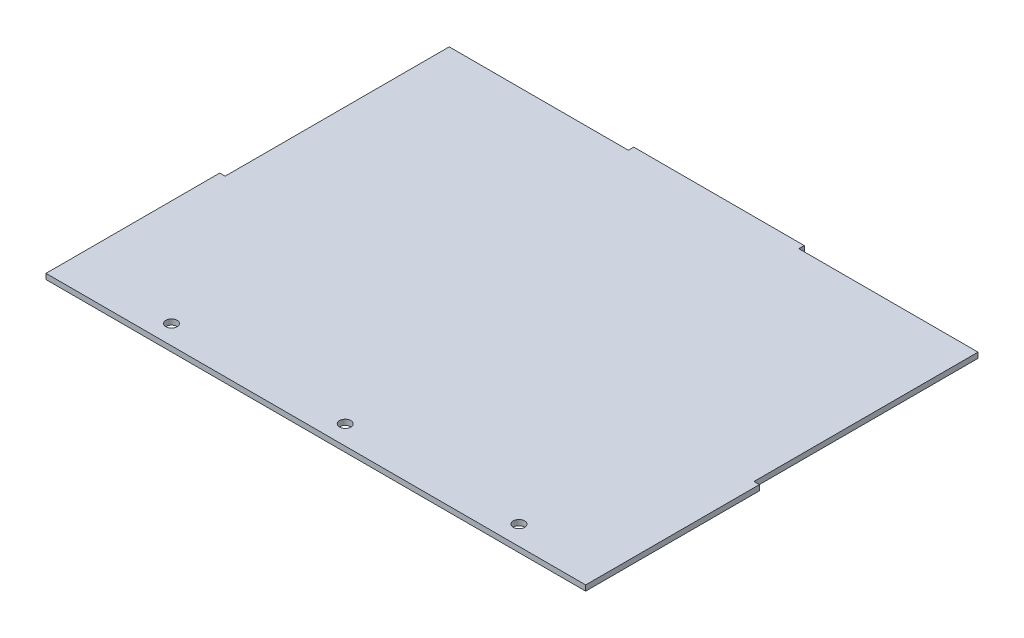
ISO-10303-21;
HEADER;
FILE_DESCRIPTION(('STEP AP214'),'2;1');
FILE_NAME('part.step','',(''),(''),'','','');
FILE_SCHEMA(('AUTOMOTIVE_DESIGN { 1 0 10303 214 1 1 1 1 }'));
ENDSEC;
DATA;
#1=APPLICATION_CONTEXT('core data for automotive mechanical design processes');
#2=APPLICATION_PROTOCOL_DEFINITION('international standard','automotive_design',2000,#1);
#3=PRODUCT_CONTEXT('',#1,'mechanical');
#4=PRODUCT('Part','Part','',(#3));
#5=PRODUCT_RELATED_PRODUCT_CATEGORY('part','',(#4));
#6=PRODUCT_DEFINITION_FORMATION('','',#4);
#7=PRODUCT_DEFINITION_CONTEXT('part definition',#1,'design');
#8=PRODUCT_DEFINITION('design','',#6,#7);
#9=PRODUCT_DEFINITION_SHAPE('','',#8);
#10=(LENGTH_UNIT() NAMED_UNIT(*) SI_UNIT(.MILLI.,.METRE.));
#11=(NAMED_UNIT(*) PLANE_ANGLE_UNIT() SI_UNIT($,.RADIAN.));
#12=(NAMED_UNIT(*) SI_UNIT($,.STERADIAN.) SOLID_ANGLE_UNIT());
#13=UNCERTAINTY_MEASURE_WITH_UNIT(LENGTH_MEASURE(1.E-05),#10,'distance_accuracy_value','');
#14=(GEOMETRIC_REPRESENTATION_CONTEXT(3) GLOBAL_UNCERTAINTY_ASSIGNED_CONTEXT((#13)) GLOBAL_UNIT_ASSIGNED_CONTEXT((#10,
#11,#12)) REPRESENTATION_CONTEXT('',''));
#15=CARTESIAN_POINT('',(0.,0.,0.));
#16=DIRECTION('',(0.,0.,1.));
#17=DIRECTION('',(1.,0.,0.));
#18=AXIS2_PLACEMENT_3D('',#15,#16,#17);
#19=CARTESIAN_POINT('',(0.,0.,0.));
#20=DIRECTION('',(0.,0.,-1.));
#21=DIRECTION('',(-1.,0.,0.));
#22=AXIS2_PLACEMENT_3D('',#19,#20,#21);
#23=PLANE('',#22);
#24=DIRECTION('',(0.,-1.,0.));
#25=VECTOR('',#24,1.);
#26=CARTESIAN_POINT('',(49.84,1.5875,0.));
#27=LINE('',#26,#25);
#28=CARTESIAN_POINT('',(49.84,1.5875,0.));
#29=VERTEX_POINT('',#28);
#30=CARTESIAN_POINT('',(49.84,-1.5875,0.));
#31=VERTEX_POINT('',#30);
#32=EDGE_CURVE('E152',#29,#31,#27,.T.);
#33=ORIENTED_EDGE('',*,*,#32,.F.);
#34=DIRECTION('',(-1.,0.,0.));
#35=VECTOR('',#34,1.);
#36=CARTESIAN_POINT('',(-157.79,1.5875,0.));
#37=LINE('',#36,#35);
#38=CARTESIAN_POINT('',(154.615,1.5875,0.));
#39=VERTEX_POINT('',#38);
#40=EDGE_CURVE('E219',#39,#29,#37,.T.);
#41=ORIENTED_EDGE('',*,*,#40,.F.);
#42=DIRECTION('',(0.,1.,0.));
#43=VECTOR('',#42,1.);
#44=CARTESIAN_POINT('',(154.615,-1.5875,0.));
#45=LINE('',#44,#43);
#46=CARTESIAN_POINT('',(154.615,-1.5875,0.));
#47=VERTEX_POINT('',#46);
#48=EDGE_CURVE('E175',#47,#39,#45,.T.);
#49=ORIENTED_EDGE('',*,*,#48,.F.);
#50=DIRECTION('',(1.,0.,0.));
#51=VECTOR('',#50,1.);
#52=CARTESIAN_POINT('',(-157.79,-1.5875,0.));
#53=LINE('',#52,#51);
#54=EDGE_CURVE('E54',#31,#47,#53,.T.);
#55=ORIENTED_EDGE('',*,*,#54,.F.);
#56=EDGE_LOOP('',(#33,#41,#49,#55));
#57=FACE_BOUND('',#56,.T.);
#58=ADVANCED_FACE('F39',(#57),#23,.T.);
#59=CARTESIAN_POINT('',(-95.7046067812089,1.5875,221.308349999902));
#60=DIRECTION('',(0.,-1.,0.));
#61=DIRECTION('',(0.,0.,-1.));
#62=AXIS2_PLACEMENT_3D('',#59,#60,#61);
#63=CYLINDRICAL_SURFACE('',#62,3.302);
#64=CARTESIAN_POINT('',(-95.7046067812089,1.5875,221.308349999902));
#65=DIRECTION('',(0.,-1.,0.));
#66=DIRECTION('',(0.,0.,-1.));
#67=AXIS2_PLACEMENT_3D('',#64,#65,#66);
#68=CIRCLE('',#67,3.302);
#69=CARTESIAN_POINT('',(-95.7046067812089,1.5875,218.006349999902));
#70=VERTEX_POINT('',#69);
#71=EDGE_CURVE('E47',#70,#70,#68,.T.);
#72=ORIENTED_EDGE('',*,*,#71,.F.);
#73=EDGE_LOOP('',(#72));
#74=FACE_BOUND('',#73,.T.);
#75=CARTESIAN_POINT('',(-95.7046067812089,-1.5875,221.308349999902));
#76=DIRECTION('',(0.,-1.,0.));
#77=DIRECTION('',(0.,0.,-1.));
#78=AXIS2_PLACEMENT_3D('',#75,#76,#77);
#79=CIRCLE('',#78,3.302);
#80=CARTESIAN_POINT('',(-95.7046067812089,-1.5875,218.006349999902));
#81=VERTEX_POINT('',#80);
#82=EDGE_CURVE('E11',#81,#81,#79,.T.);
#83=ORIENTED_EDGE('',*,*,#82,.T.);
#84=EDGE_LOOP('',(#83));
#85=FACE_BOUND('',#84,.T.);
#86=ADVANCED_FACE('F41',(#74,#85),#63,.F.);
#87=CARTESIAN_POINT('',(157.79,-1.5875,232.600000128));
#88=DIRECTION('',(-1.,0.,0.));
#89=DIRECTION('',(0.,0.,1.));
#90=AXIS2_PLACEMENT_3D('',#87,#88,#89);
#91=PLANE('',#90);
#92=DIRECTION('',(0.,1.,0.));
#93=VECTOR('',#92,1.);
#94=CARTESIAN_POINT('',(157.79,-1.5875,130.999992));
#95=LINE('',#94,#93);
#96=CARTESIAN_POINT('',(157.79,-1.5875,130.999992));
#97=VERTEX_POINT('',#96);
#98=CARTESIAN_POINT('',(157.79,1.5875,130.999992));
#99=VERTEX_POINT('',#98);
#100=EDGE_CURVE('E176',#97,#99,#95,.T.);
#101=ORIENTED_EDGE('',*,*,#100,.T.);
#102=DIRECTION('',(0.,0.,-1.));
#103=VECTOR('',#102,1.);
#104=CARTESIAN_POINT('',(157.79,1.5875,232.600000128));
#105=LINE('',#104,#103);
#106=CARTESIAN_POINT('',(157.79,1.5875,232.600000128));
#107=VERTEX_POINT('',#106);
#108=EDGE_CURVE('E231',#107,#99,#105,.T.);
#109=ORIENTED_EDGE('',*,*,#108,.F.);
#110=DIRECTION('',(0.,1.,0.));
#111=VECTOR('',#110,1.);
#112=CARTESIAN_POINT('',(157.79,-1.5875,232.600000128));
#113=LINE('',#112,#111);
#114=CARTESIAN_POINT('',(157.79,-1.5875,232.600000128));
#115=VERTEX_POINT('',#114);
#116=EDGE_CURVE('E208',#115,#107,#113,.T.);
#117=ORIENTED_EDGE('',*,*,#116,.F.);
#118=DIRECTION('',(0.,0.,-1.));
#119=VECTOR('',#118,1.);
#120=CARTESIAN_POINT('',(157.79,-1.5875,232.600000128));
#121=LINE('',#120,#119);
#122=EDGE_CURVE('E218',#115,#97,#121,.T.);
#123=ORIENTED_EDGE('',*,*,#122,.T.);
#124=EDGE_LOOP('',(#101,#109,#117,#123));
#125=FACE_BOUND('',#124,.T.);
#126=ADVANCED_FACE('F240',(#125),#91,.F.);
#127=CARTESIAN_POINT('',(-157.79,1.5875,232.600000128));
#128=DIRECTION('',(0.,-1.,0.));
#129=DIRECTION('',(0.,0.,-1.));
#130=AXIS2_PLACEMENT_3D('',#127,#128,#129);
#131=PLANE('',#130);
#132=CARTESIAN_POINT('',(5.89539321879114,1.5875,221.308349999902));
#133=DIRECTION('',(0.,-1.,0.));
#134=DIRECTION('',(0.,0.,-1.));
#135=AXIS2_PLACEMENT_3D('',#132,#133,#134);
#136=CIRCLE('',#135,3.302);
#137=CARTESIAN_POINT('',(5.89539321879114,1.5875,218.006349999902));
#138=VERTEX_POINT('',#137);
#139=EDGE_CURVE('E153',#138,#138,#136,.T.);
#140=ORIENTED_EDGE('',*,*,#139,.T.);
#141=EDGE_LOOP('',(#140));
#142=FACE_BOUND('',#141,.T.);
#143=CARTESIAN_POINT('',(107.495393218791,1.5875,221.308349999902));
#144=DIRECTION('',(0.,-1.,0.));
#145=DIRECTION('',(0.,0.,-1.));
#146=AXIS2_PLACEMENT_3D('',#143,#144,#145);
#147=CIRCLE('',#146,3.302);
#148=CARTESIAN_POINT('',(107.495393218791,1.5875,218.006349999902));
#149=VERTEX_POINT('',#148);
#150=EDGE_CURVE('E165',#149,#149,#147,.T.);
#151=ORIENTED_EDGE('',*,*,#150,.T.);
#152=EDGE_LOOP('',(#151));
#153=FACE_BOUND('',#152,.T.);
#154=DIRECTION('',(1.,0.,0.));
#155=VECTOR('',#154,1.);
#156=CARTESIAN_POINT('',(-157.79,1.5875,130.999992));
#157=LINE('',#156,#155);
#158=CARTESIAN_POINT('',(154.615,1.5875,130.999992));
#159=VERTEX_POINT('',#158);
#160=EDGE_CURVE('E185',#159,#99,#157,.T.);
#161=ORIENTED_EDGE('',*,*,#160,.F.);
#162=DIRECTION('',(0.,0.,1.));
#163=VECTOR('',#162,1.);
#164=CARTESIAN_POINT('',(154.615,1.5875,232.600000128));
#165=LINE('',#164,#163);
#166=EDGE_CURVE('E179',#39,#159,#165,.T.);
#167=ORIENTED_EDGE('',*,*,#166,.F.);
#168=ORIENTED_EDGE('',*,*,#40,.T.);
#169=DIRECTION('',(0.,0.,1.));
#170=VECTOR('',#169,1.);
#171=CARTESIAN_POINT('',(49.84,1.5875,-3.175));
#172=LINE('',#171,#170);
#173=CARTESIAN_POINT('',(49.84,1.5875,-3.175));
#174=VERTEX_POINT('',#173);
#175=EDGE_CURVE('E445',#174,#29,#172,.T.);
#176=ORIENTED_EDGE('',*,*,#175,.F.);
#177=DIRECTION('',(1.,0.,0.));
#178=VECTOR('',#177,1.);
#179=CARTESIAN_POINT('',(49.84,1.5875,-3.175));
#180=LINE('',#179,#178);
#181=CARTESIAN_POINT('',(-49.84,1.5875,-3.175));
#182=VERTEX_POINT('',#181);
#183=EDGE_CURVE('E146',#182,#174,#180,.T.);
#184=ORIENTED_EDGE('',*,*,#183,.F.);
#185=DIRECTION('',(0.,0.,1.));
#186=VECTOR('',#185,1.);
#187=CARTESIAN_POINT('',(-49.84,1.5875,-3.175));
#188=LINE('',#187,#186);
#189=CARTESIAN_POINT('',(-49.84,1.5875,0.));
#190=VERTEX_POINT('',#189);
#191=EDGE_CURVE('E158',#182,#190,#188,.T.);
#192=ORIENTED_EDGE('',*,*,#191,.T.);
#193=CARTESIAN_POINT('',(-154.615,1.5875,0.));
#194=VERTEX_POINT('',#193);
#195=EDGE_CURVE('E207',#190,#194,#37,.T.);
#196=ORIENTED_EDGE('',*,*,#195,.T.);
#197=DIRECTION('',(0.,0.,1.));
#198=VECTOR('',#197,1.);
#199=CARTESIAN_POINT('',(-154.615,1.5875,232.600000128));
#200=LINE('',#199,#198);
#201=CARTESIAN_POINT('',(-154.615,1.5875,130.999992));
#202=VERTEX_POINT('',#201);
#203=EDGE_CURVE('E197',#194,#202,#200,.T.);
#204=ORIENTED_EDGE('',*,*,#203,.T.);
#205=DIRECTION('',(-1.,0.,0.));
#206=VECTOR('',#205,1.);
#207=CARTESIAN_POINT('',(-157.79,1.5875,130.999992));
#208=LINE('',#207,#206);
#209=CARTESIAN_POINT('',(-157.79,1.5875,130.999992));
#210=VERTEX_POINT('',#209);
#211=EDGE_CURVE('E204',#202,#210,#208,.T.);
#212=ORIENTED_EDGE('',*,*,#211,.T.);
#213=DIRECTION('',(0.,0.,-1.));
#214=VECTOR('',#213,1.);
#215=CARTESIAN_POINT('',(-157.79,1.5875,232.600000128));
#216=LINE('',#215,#214);
#217=CARTESIAN_POINT('',(-157.79,1.5875,232.600000128));
#218=VERTEX_POINT('',#217);
#219=EDGE_CURVE('E228',#218,#210,#216,.T.);
#220=ORIENTED_EDGE('',*,*,#219,.F.);
#221=DIRECTION('',(-1.,0.,0.));
#222=VECTOR('',#221,1.);
#223=CARTESIAN_POINT('',(-157.79,1.5875,232.600000128));
#224=LINE('',#223,#222);
#225=EDGE_CURVE('E211',#107,#218,#224,.T.);
#226=ORIENTED_EDGE('',*,*,#225,.F.);
#227=ORIENTED_EDGE('',*,*,#108,.T.);
#228=EDGE_LOOP('',(#161,#167,#168,#176,#184,#192,#196,#204,#212,#220,#226,#227));
#229=FACE_BOUND('',#228,.T.);
#230=ORIENTED_EDGE('',*,*,#71,.T.);
#231=EDGE_LOOP('',(#230));
#232=FACE_BOUND('',#231,.T.);
#233=ADVANCED_FACE('F236',(#142,#153,#229,#232),#131,.F.);
#234=CARTESIAN_POINT('',(-157.79,-1.5875,232.600000128));
#235=DIRECTION('',(0.,1.,0.));
#236=DIRECTION('',(0.,0.,1.));
#237=AXIS2_PLACEMENT_3D('',#234,#235,#236);
#238=PLANE('',#237);
#239=CARTESIAN_POINT('',(5.89539321879114,-1.5875,221.308349999902));
#240=DIRECTION('',(0.,-1.,0.));
#241=DIRECTION('',(0.,0.,-1.));
#242=AXIS2_PLACEMENT_3D('',#239,#240,#241);
#243=CIRCLE('',#242,3.302);
#244=CARTESIAN_POINT('',(5.89539321879114,-1.5875,218.006349999902));
#245=VERTEX_POINT('',#244);
#246=EDGE_CURVE('E156',#245,#245,#243,.T.);
#247=ORIENTED_EDGE('',*,*,#246,.F.);
#248=EDGE_LOOP('',(#247));
#249=FACE_BOUND('',#248,.T.);
#250=CARTESIAN_POINT('',(107.495393218791,-1.5875,221.308349999902));
#251=DIRECTION('',(0.,-1.,0.));
#252=DIRECTION('',(0.,0.,-1.));
#253=AXIS2_PLACEMENT_3D('',#250,#251,#252);
#254=CIRCLE('',#253,3.302);
#255=CARTESIAN_POINT('',(107.495393218791,-1.5875,218.006349999902));
#256=VERTEX_POINT('',#255);
#257=EDGE_CURVE('E164',#256,#256,#254,.T.);
#258=ORIENTED_EDGE('',*,*,#257,.F.);
#259=EDGE_LOOP('',(#258));
#260=FACE_BOUND('',#259,.T.);
#261=DIRECTION('',(-1.,0.,0.));
#262=VECTOR('',#261,1.);
#263=CARTESIAN_POINT('',(157.79,-1.5875,130.999992));
#264=LINE('',#263,#262);
#265=CARTESIAN_POINT('',(154.615,-1.5875,130.999992));
#266=VERTEX_POINT('',#265);
#267=EDGE_CURVE('E173',#97,#266,#264,.T.);
#268=ORIENTED_EDGE('',*,*,#267,.F.);
#269=ORIENTED_EDGE('',*,*,#122,.F.);
#270=DIRECTION('',(1.,0.,0.));
#271=VECTOR('',#270,1.);
#272=CARTESIAN_POINT('',(-157.79,-1.5875,232.600000128));
#273=LINE('',#272,#271);
#274=CARTESIAN_POINT('',(-157.79,-1.5875,232.600000128));
#275=VERTEX_POINT('',#274);
#276=EDGE_CURVE('E216',#275,#115,#273,.T.);
#277=ORIENTED_EDGE('',*,*,#276,.F.);
#278=DIRECTION('',(0.,0.,-1.));
#279=VECTOR('',#278,1.);
#280=CARTESIAN_POINT('',(-157.79,-1.5875,232.600000128));
#281=LINE('',#280,#279);
#282=CARTESIAN_POINT('',(-157.79,-1.5875,130.999992));
#283=VERTEX_POINT('',#282);
#284=EDGE_CURVE('E225',#275,#283,#281,.T.);
#285=ORIENTED_EDGE('',*,*,#284,.T.);
#286=DIRECTION('',(1.,0.,0.));
#287=VECTOR('',#286,1.);
#288=CARTESIAN_POINT('',(-157.79,-1.5875,130.999992));
#289=LINE('',#288,#287);
#290=CARTESIAN_POINT('',(-154.615,-1.5875,130.999992));
#291=VERTEX_POINT('',#290);
#292=EDGE_CURVE('E187',#283,#291,#289,.T.);
#293=ORIENTED_EDGE('',*,*,#292,.T.);
#294=DIRECTION('',(0.,0.,-1.));
#295=VECTOR('',#294,1.);
#296=CARTESIAN_POINT('',(-154.615,-1.5875,0.));
#297=LINE('',#296,#295);
#298=CARTESIAN_POINT('',(-154.615,-1.5875,0.));
#299=VERTEX_POINT('',#298);
#300=EDGE_CURVE('E190',#291,#299,#297,.T.);
#301=ORIENTED_EDGE('',*,*,#300,.T.);
#302=CARTESIAN_POINT('',(-49.84,-1.5875,0.));
#303=VERTEX_POINT('',#302);
#304=EDGE_CURVE('E212',#299,#303,#53,.T.);
#305=ORIENTED_EDGE('',*,*,#304,.T.);
#306=DIRECTION('',(0.,0.,1.));
#307=VECTOR('',#306,1.);
#308=CARTESIAN_POINT('',(-49.84,-1.5875,-3.175));
#309=LINE('',#308,#307);
#310=CARTESIAN_POINT('',(-49.84,-1.5875,-3.175));
#311=VERTEX_POINT('',#310);
#312=EDGE_CURVE('E137',#311,#303,#309,.T.);
#313=ORIENTED_EDGE('',*,*,#312,.F.);
#314=DIRECTION('',(-1.,0.,0.));
#315=VECTOR('',#314,1.);
#316=CARTESIAN_POINT('',(49.84,-1.5875,-3.175));
#317=LINE('',#316,#315);
#318=CARTESIAN_POINT('',(49.84,-1.5875,-3.175));
#319=VERTEX_POINT('',#318);
#320=EDGE_CURVE('E128',#319,#311,#317,.T.);
#321=ORIENTED_EDGE('',*,*,#320,.F.);
#322=DIRECTION('',(0.,0.,1.));
#323=VECTOR('',#322,1.);
#324=CARTESIAN_POINT('',(49.84,-1.5875,-3.175));
#325=LINE('',#324,#323);
#326=EDGE_CURVE('E134',#319,#31,#325,.T.);
#327=ORIENTED_EDGE('',*,*,#326,.T.);
#328=ORIENTED_EDGE('',*,*,#54,.T.);
#329=DIRECTION('',(0.,0.,-1.));
#330=VECTOR('',#329,1.);
#331=CARTESIAN_POINT('',(154.615,-1.5875,0.));
#332=LINE('',#331,#330);
#333=EDGE_CURVE('E168',#266,#47,#332,.T.);
#334=ORIENTED_EDGE('',*,*,#333,.F.);
#335=EDGE_LOOP('',(#268,#269,#277,#285,#293,#301,#305,#313,#321,#327,#328,#334));
#336=FACE_BOUND('',#335,.T.);
#337=ORIENTED_EDGE('',*,*,#82,.F.);
#338=EDGE_LOOP('',(#337));
#339=FACE_BOUND('',#338,.T.);
#340=ADVANCED_FACE('F131',(#249,#260,#336,#339),#238,.F.);
#341=DIRECTION('',(0.,1.,0.));
#342=VECTOR('',#341,1.);
#343=CARTESIAN_POINT('',(-49.84,1.5875,0.));
#344=LINE('',#343,#342);
#345=EDGE_CURVE('E62',#303,#190,#344,.T.);
#346=ORIENTED_EDGE('',*,*,#345,.F.);
#347=ORIENTED_EDGE('',*,*,#304,.F.);
#348=DIRECTION('',(0.,1.,0.));
#349=VECTOR('',#348,1.);
#350=CARTESIAN_POINT('',(-154.615,-1.5875,0.));
#351=LINE('',#350,#349);
#352=EDGE_CURVE('E194',#299,#194,#351,.T.);
#353=ORIENTED_EDGE('',*,*,#352,.T.);
#354=ORIENTED_EDGE('',*,*,#195,.F.);
#355=EDGE_LOOP('',(#346,#347,#353,#354));
#356=FACE_BOUND('',#355,.T.);
#357=ADVANCED_FACE('F243',(#356),#23,.T.);
#358=CARTESIAN_POINT('',(-157.79,-1.5875,232.600000128));
#359=DIRECTION('',(1.,0.,0.));
#360=DIRECTION('',(0.,0.,-1.));
#361=AXIS2_PLACEMENT_3D('',#358,#359,#360);
#362=PLANE('',#361);
#363=ORIENTED_EDGE('',*,*,#219,.T.);
#364=DIRECTION('',(0.,1.,0.));
#365=VECTOR('',#364,1.);
#366=CARTESIAN_POINT('',(-157.79,-1.5875,130.999992));
#367=LINE('',#366,#365);
#368=EDGE_CURVE('E193',#283,#210,#367,.T.);
#369=ORIENTED_EDGE('',*,*,#368,.F.);
#370=ORIENTED_EDGE('',*,*,#284,.F.);
#371=DIRECTION('',(0.,-1.,0.));
#372=VECTOR('',#371,1.);
#373=CARTESIAN_POINT('',(-157.79,-1.5875,232.600000128));
#374=LINE('',#373,#372);
#375=EDGE_CURVE('E214',#218,#275,#374,.T.);
#376=ORIENTED_EDGE('',*,*,#375,.F.);
#377=EDGE_LOOP('',(#363,#369,#370,#376));
#378=FACE_BOUND('',#377,.T.);
#379=ADVANCED_FACE('F250',(#378),#362,.F.);
#380=CARTESIAN_POINT('',(0.,0.,232.600000128));
#381=DIRECTION('',(0.,0.,-1.));
#382=DIRECTION('',(-1.,0.,0.));
#383=AXIS2_PLACEMENT_3D('',#380,#381,#382);
#384=PLANE('',#383);
#385=ORIENTED_EDGE('',*,*,#116,.T.);
#386=ORIENTED_EDGE('',*,*,#225,.T.);
#387=ORIENTED_EDGE('',*,*,#375,.T.);
#388=ORIENTED_EDGE('',*,*,#276,.T.);
#389=EDGE_LOOP('',(#385,#386,#387,#388));
#390=FACE_BOUND('',#389,.T.);
#391=ADVANCED_FACE('F261',(#390),#384,.F.);
#392=CARTESIAN_POINT('',(-157.79,-1.5875,130.999992));
#393=DIRECTION('',(0.,0.,1.));
#394=DIRECTION('',(1.,0.,0.));
#395=AXIS2_PLACEMENT_3D('',#392,#393,#394);
#396=PLANE('',#395);
#397=DIRECTION('',(0.,1.,0.));
#398=VECTOR('',#397,1.);
#399=CARTESIAN_POINT('',(-154.615,-1.5875,130.999992));
#400=LINE('',#399,#398);
#401=EDGE_CURVE('E198',#291,#202,#400,.T.);
#402=ORIENTED_EDGE('',*,*,#401,.F.);
#403=ORIENTED_EDGE('',*,*,#292,.F.);
#404=ORIENTED_EDGE('',*,*,#368,.T.);
#405=ORIENTED_EDGE('',*,*,#211,.F.);
#406=EDGE_LOOP('',(#402,#403,#404,#405));
#407=FACE_BOUND('',#406,.T.);
#408=ADVANCED_FACE('F264',(#407),#396,.F.);
#409=CARTESIAN_POINT('',(-154.615,-1.5875,0.));
#410=DIRECTION('',(1.,0.,0.));
#411=DIRECTION('',(0.,0.,-1.));
#412=AXIS2_PLACEMENT_3D('',#409,#410,#411);
#413=PLANE('',#412);
#414=ORIENTED_EDGE('',*,*,#352,.F.);
#415=ORIENTED_EDGE('',*,*,#300,.F.);
#416=ORIENTED_EDGE('',*,*,#401,.T.);
#417=ORIENTED_EDGE('',*,*,#203,.F.);
#418=EDGE_LOOP('',(#414,#415,#416,#417));
#419=FACE_BOUND('',#418,.T.);
#420=ADVANCED_FACE('F268',(#419),#413,.F.);
#421=CARTESIAN_POINT('',(157.79,-1.5875,130.999992));
#422=DIRECTION('',(0.,0.,-1.));
#423=DIRECTION('',(-1.,0.,0.));
#424=AXIS2_PLACEMENT_3D('',#421,#422,#423);
#425=PLANE('',#424);
#426=ORIENTED_EDGE('',*,*,#160,.T.);
#427=ORIENTED_EDGE('',*,*,#100,.F.);
#428=ORIENTED_EDGE('',*,*,#267,.T.);
#429=DIRECTION('',(0.,1.,0.));
#430=VECTOR('',#429,1.);
#431=CARTESIAN_POINT('',(154.615,-1.5875,130.999992));
#432=LINE('',#431,#430);
#433=EDGE_CURVE('E180',#266,#159,#432,.T.);
#434=ORIENTED_EDGE('',*,*,#433,.T.);
#435=EDGE_LOOP('',(#426,#427,#428,#434));
#436=FACE_BOUND('',#435,.T.);
#437=ADVANCED_FACE('F272',(#436),#425,.T.);
#438=CARTESIAN_POINT('',(154.615,-1.5875,0.));
#439=DIRECTION('',(1.,0.,0.));
#440=DIRECTION('',(0.,0.,-1.));
#441=AXIS2_PLACEMENT_3D('',#438,#439,#440);
#442=PLANE('',#441);
#443=ORIENTED_EDGE('',*,*,#166,.T.);
#444=ORIENTED_EDGE('',*,*,#433,.F.);
#445=ORIENTED_EDGE('',*,*,#333,.T.);
#446=ORIENTED_EDGE('',*,*,#48,.T.);
#447=EDGE_LOOP('',(#443,#444,#445,#446));
#448=FACE_BOUND('',#447,.T.);
#449=ADVANCED_FACE('F274',(#448),#442,.T.);
#450=CARTESIAN_POINT('',(107.495393218791,1.5875,221.308349999902));
#451=DIRECTION('',(0.,-1.,0.));
#452=DIRECTION('',(0.,0.,-1.));
#453=AXIS2_PLACEMENT_3D('',#450,#451,#452);
#454=CYLINDRICAL_SURFACE('',#453,3.302);
#455=ORIENTED_EDGE('',*,*,#150,.F.);
#456=EDGE_LOOP('',(#455));
#457=FACE_BOUND('',#456,.T.);
#458=ORIENTED_EDGE('',*,*,#257,.T.);
#459=EDGE_LOOP('',(#458));
#460=FACE_BOUND('',#459,.T.);
#461=ADVANCED_FACE('F277',(#457,#460),#454,.F.);
#462=CARTESIAN_POINT('',(5.89539321879114,1.5875,221.308349999902));
#463=DIRECTION('',(0.,-1.,0.));
#464=DIRECTION('',(0.,0.,-1.));
#465=AXIS2_PLACEMENT_3D('',#462,#463,#464);
#466=CYLINDRICAL_SURFACE('',#465,3.302);
#467=ORIENTED_EDGE('',*,*,#139,.F.);
#468=EDGE_LOOP('',(#467));
#469=FACE_BOUND('',#468,.T.);
#470=ORIENTED_EDGE('',*,*,#246,.T.);
#471=EDGE_LOOP('',(#470));
#472=FACE_BOUND('',#471,.T.);
#473=ADVANCED_FACE('F284',(#469,#472),#466,.F.);
#474=CARTESIAN_POINT('',(49.84,1.5875,-3.175));
#475=DIRECTION('',(-1.,0.,0.));
#476=DIRECTION('',(0.,0.,1.));
#477=AXIS2_PLACEMENT_3D('',#474,#475,#476);
#478=PLANE('',#477);
#479=ORIENTED_EDGE('',*,*,#32,.T.);
#480=ORIENTED_EDGE('',*,*,#326,.F.);
#481=DIRECTION('',(0.,-1.,0.));
#482=VECTOR('',#481,1.);
#483=CARTESIAN_POINT('',(49.84,1.5875,-3.175));
#484=LINE('',#483,#482);
#485=EDGE_CURVE('E141',#174,#319,#484,.T.);
#486=ORIENTED_EDGE('',*,*,#485,.F.);
#487=ORIENTED_EDGE('',*,*,#175,.T.);
#488=EDGE_LOOP('',(#479,#480,#486,#487));
#489=FACE_BOUND('',#488,.T.);
#490=ADVANCED_FACE('F151',(#489),#478,.F.);
#491=CARTESIAN_POINT('',(-49.84,1.5875,-3.175));
#492=DIRECTION('',(1.,0.,0.));
#493=DIRECTION('',(0.,0.,-1.));
#494=AXIS2_PLACEMENT_3D('',#491,#492,#493);
#495=PLANE('',#494);
#496=ORIENTED_EDGE('',*,*,#345,.T.);
#497=ORIENTED_EDGE('',*,*,#191,.F.);
#498=DIRECTION('',(0.,1.,0.));
#499=VECTOR('',#498,1.);
#500=CARTESIAN_POINT('',(-49.84,1.5875,-3.175));
#501=LINE('',#500,#499);
#502=EDGE_CURVE('E140',#311,#182,#501,.T.);
#503=ORIENTED_EDGE('',*,*,#502,.F.);
#504=ORIENTED_EDGE('',*,*,#312,.T.);
#505=EDGE_LOOP('',(#496,#497,#503,#504));
#506=FACE_BOUND('',#505,.T.);
#507=ADVANCED_FACE('F291',(#506),#495,.F.);
#508=CARTESIAN_POINT('',(0.,0.,-3.175));
#509=DIRECTION('',(0.,0.,-1.));
#510=DIRECTION('',(-1.,0.,0.));
#511=AXIS2_PLACEMENT_3D('',#508,#509,#510);
#512=PLANE('',#511);
#513=ORIENTED_EDGE('',*,*,#485,.T.);
#514=ORIENTED_EDGE('',*,*,#320,.T.);
#515=ORIENTED_EDGE('',*,*,#502,.T.);
#516=ORIENTED_EDGE('',*,*,#183,.T.);
#517=EDGE_LOOP('',(#513,#514,#515,#516));
#518=FACE_BOUND('',#517,.T.);
#519=ADVANCED_FACE('F144',(#518),#512,.T.);
#520=CLOSED_SHELL('',(#58,#86,#126,#233,#340,#357,#379,#391,#408,#420,#437,#449,#461,#473,#490,
#507,#519));
#521=MANIFOLD_SOLID_BREP('B2',#520);
#522=ADVANCED_BREP_SHAPE_REPRESENTATION('',(#18,#521),#14);
#523=SHAPE_DEFINITION_REPRESENTATION(#9,#522);
ENDSEC;
END-ISO-10303-21;
